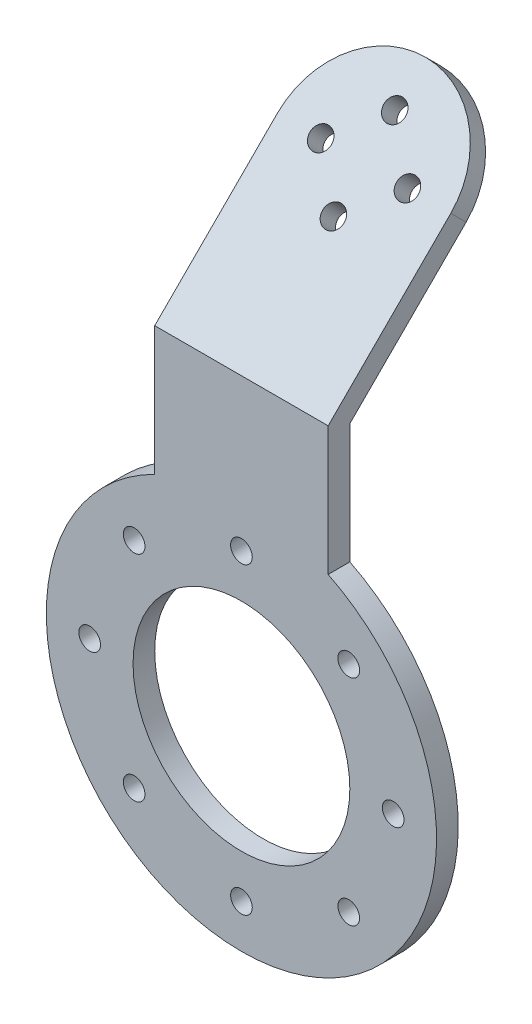
ISO-10303-21;
HEADER;
FILE_DESCRIPTION(('STEP AP214'),'2;1');
FILE_NAME('part.step','',(''),(''),'','','');
FILE_SCHEMA(('AUTOMOTIVE_DESIGN { 1 0 10303 214 1 1 1 1 }'));
ENDSEC;
DATA;
#1=APPLICATION_CONTEXT('core data for automotive mechanical design processes');
#2=APPLICATION_PROTOCOL_DEFINITION('international standard','automotive_design',2000,#1);
#3=PRODUCT_CONTEXT('',#1,'mechanical');
#4=PRODUCT('Part','Part','',(#3));
#5=PRODUCT_RELATED_PRODUCT_CATEGORY('part','',(#4));
#6=PRODUCT_DEFINITION_FORMATION('','',#4);
#7=PRODUCT_DEFINITION_CONTEXT('part definition',#1,'design');
#8=PRODUCT_DEFINITION('design','',#6,#7);
#9=PRODUCT_DEFINITION_SHAPE('','',#8);
#10=(LENGTH_UNIT() NAMED_UNIT(*) SI_UNIT(.MILLI.,.METRE.));
#11=(NAMED_UNIT(*) PLANE_ANGLE_UNIT() SI_UNIT($,.RADIAN.));
#12=(NAMED_UNIT(*) SI_UNIT($,.STERADIAN.) SOLID_ANGLE_UNIT());
#13=UNCERTAINTY_MEASURE_WITH_UNIT(LENGTH_MEASURE(1.E-05),#10,'distance_accuracy_value','');
#14=(GEOMETRIC_REPRESENTATION_CONTEXT(3) GLOBAL_UNCERTAINTY_ASSIGNED_CONTEXT((#13)) GLOBAL_UNIT_ASSIGNED_CONTEXT((#10,
#11,#12)) REPRESENTATION_CONTEXT('',''));
#15=CARTESIAN_POINT('',(0.,0.,0.));
#16=DIRECTION('',(0.,0.,1.));
#17=DIRECTION('',(1.,0.,0.));
#18=AXIS2_PLACEMENT_3D('',#15,#16,#17);
#19=CARTESIAN_POINT('',(0.,0.,3.175));
#20=DIRECTION('',(0.,0.,1.));
#21=DIRECTION('',(1.,0.,0.));
#22=AXIS2_PLACEMENT_3D('',#19,#20,#21);
#23=PLANE('',#22);
#24=CARTESIAN_POINT('',(15.7154482118708,15.7154482118712,3.175));
#25=DIRECTION('',(0.,0.,1.));
#26=DIRECTION('',(0.707106781186556,-0.707106781186539,0.));
#27=AXIS2_PLACEMENT_3D('',#24,#25,#26);
#28=CIRCLE('',#27,1.5875);
#29=CARTESIAN_POINT('',(16.8379802270045,14.5929161967376,3.175));
#30=VERTEX_POINT('',#29);
#31=EDGE_CURVE('E271',#30,#30,#28,.T.);
#32=ORIENTED_EDGE('',*,*,#31,.F.);
#33=EDGE_LOOP('',(#32));
#34=FACE_BOUND('',#33,.T.);
#35=CARTESIAN_POINT('',(22.225,2.32794518267366E-13,3.175));
#36=DIRECTION('',(0.,0.,1.));
#37=DIRECTION('',(0.,-1.,0.));
#38=AXIS2_PLACEMENT_3D('',#35,#36,#37);
#39=CIRCLE('',#38,1.5875);
#40=CARTESIAN_POINT('',(22.225,-1.58749999999977,3.175));
#41=VERTEX_POINT('',#40);
#42=EDGE_CURVE('E582',#41,#41,#39,.T.);
#43=ORIENTED_EDGE('',*,*,#42,.F.);
#44=EDGE_LOOP('',(#43));
#45=FACE_BOUND('',#44,.T.);
#46=CARTESIAN_POINT('',(15.7154482118712,-15.7154482118709,3.175));
#47=DIRECTION('',(0.,0.,1.));
#48=DIRECTION('',(-0.707106781186541,-0.707106781186554,0.));
#49=AXIS2_PLACEMENT_3D('',#46,#47,#48);
#50=CIRCLE('',#49,1.5875);
#51=CARTESIAN_POINT('',(14.5929161967375,-16.8379802270045,3.175));
#52=VERTEX_POINT('',#51);
#53=EDGE_CURVE('E321',#52,#52,#50,.T.);
#54=ORIENTED_EDGE('',*,*,#53,.F.);
#55=EDGE_LOOP('',(#54));
#56=FACE_BOUND('',#55,.T.);
#57=CARTESIAN_POINT('',(1.55196345511577E-13,-22.225,3.175));
#58=DIRECTION('',(0.,0.,1.));
#59=DIRECTION('',(-1.,0.,0.));
#60=AXIS2_PLACEMENT_3D('',#57,#58,#59);
#61=CIRCLE('',#60,1.5875);
#62=CARTESIAN_POINT('',(-1.58749999999984,-22.225,3.175));
#63=VERTEX_POINT('',#62);
#64=EDGE_CURVE('E316',#63,#63,#61,.T.);
#65=ORIENTED_EDGE('',*,*,#64,.F.);
#66=EDGE_LOOP('',(#65));
#67=FACE_BOUND('',#66,.T.);
#68=CARTESIAN_POINT('',(-15.7154482118709,-15.7154482118711,3.175));
#69=DIRECTION('',(0.,0.,1.));
#70=DIRECTION('',(-0.707106781186551,0.707106781186544,0.));
#71=AXIS2_PLACEMENT_3D('',#68,#69,#70);
#72=CIRCLE('',#71,1.5875);
#73=CARTESIAN_POINT('',(-16.8379802270046,-14.5929161967375,3.175));
#74=VERTEX_POINT('',#73);
#75=EDGE_CURVE('E200',#74,#74,#72,.T.);
#76=ORIENTED_EDGE('',*,*,#75,.F.);
#77=EDGE_LOOP('',(#76));
#78=FACE_BOUND('',#77,.T.);
#79=CARTESIAN_POINT('',(-22.225,0.,3.175));
#80=DIRECTION('',(0.,0.,1.));
#81=DIRECTION('',(0.,1.,0.));
#82=AXIS2_PLACEMENT_3D('',#79,#80,#81);
#83=CIRCLE('',#82,1.5875);
#84=CARTESIAN_POINT('',(-22.225,1.58749999999992,3.175));
#85=VERTEX_POINT('',#84);
#86=EDGE_CURVE('E193',#85,#85,#83,.T.);
#87=ORIENTED_EDGE('',*,*,#86,.F.);
#88=EDGE_LOOP('',(#87));
#89=FACE_BOUND('',#88,.T.);
#90=CARTESIAN_POINT('',(-15.715448211871,15.715448211871,3.175));
#91=DIRECTION('',(0.,0.,1.));
#92=DIRECTION('',(0.707106781186546,0.707106781186549,0.));
#93=AXIS2_PLACEMENT_3D('',#90,#91,#92);
#94=CIRCLE('',#93,1.5875);
#95=CARTESIAN_POINT('',(-14.5929161967374,16.8379802270046,3.175));
#96=VERTEX_POINT('',#95);
#97=EDGE_CURVE('E203',#96,#96,#94,.T.);
#98=ORIENTED_EDGE('',*,*,#97,.F.);
#99=EDGE_LOOP('',(#98));
#100=FACE_BOUND('',#99,.T.);
#101=CARTESIAN_POINT('',(0.,22.225,3.175));
#102=DIRECTION('',(0.,0.,1.));
#103=DIRECTION('',(1.,0.,0.));
#104=AXIS2_PLACEMENT_3D('',#101,#102,#103);
#105=CIRCLE('',#104,1.5875);
#106=CARTESIAN_POINT('',(1.5875,22.225,3.175));
#107=VERTEX_POINT('',#106);
#108=EDGE_CURVE('E179',#107,#107,#105,.T.);
#109=ORIENTED_EDGE('',*,*,#108,.F.);
#110=EDGE_LOOP('',(#109));
#111=FACE_BOUND('',#110,.T.);
#112=CARTESIAN_POINT('',(0.,0.,3.175));
#113=DIRECTION('',(0.,0.,1.));
#114=DIRECTION('',(1.,0.,0.));
#115=AXIS2_PLACEMENT_3D('',#112,#113,#114);
#116=CIRCLE('',#115,28.575);
#117=CARTESIAN_POINT('',(-12.7,25.5976683508479,3.175));
#118=VERTEX_POINT('',#117);
#119=CARTESIAN_POINT('',(12.7,25.5976683508479,3.175));
#120=VERTEX_POINT('',#119);
#121=EDGE_CURVE('E121',#118,#120,#116,.T.);
#122=ORIENTED_EDGE('',*,*,#121,.T.);
#123=DIRECTION('',(0.,1.,0.));
#124=VECTOR('',#123,1.);
#125=CARTESIAN_POINT('',(12.7,25.5976683508479,3.175));
#126=LINE('',#125,#124);
#127=CARTESIAN_POINT('',(12.7,44.45,3.175));
#128=VERTEX_POINT('',#127);
#129=EDGE_CURVE('E110',#120,#128,#126,.T.);
#130=ORIENTED_EDGE('',*,*,#129,.T.);
#131=DIRECTION('',(-1.,0.,0.));
#132=VECTOR('',#131,1.);
#133=CARTESIAN_POINT('',(-12.7,44.45,3.175));
#134=LINE('',#133,#132);
#135=CARTESIAN_POINT('',(-12.7,44.45,3.175));
#136=VERTEX_POINT('',#135);
#137=EDGE_CURVE('E120',#128,#136,#134,.T.);
#138=ORIENTED_EDGE('',*,*,#137,.T.);
#139=DIRECTION('',(0.,-1.,0.));
#140=VECTOR('',#139,1.);
#141=CARTESIAN_POINT('',(-12.7,25.5976683508479,3.175));
#142=LINE('',#141,#140);
#143=EDGE_CURVE('E72',#136,#118,#142,.T.);
#144=ORIENTED_EDGE('',*,*,#143,.T.);
#145=EDGE_LOOP('',(#122,#130,#138,#144));
#146=FACE_BOUND('',#145,.T.);
#147=CARTESIAN_POINT('',(0.,0.,3.175));
#148=DIRECTION('',(0.,0.,1.));
#149=DIRECTION('',(1.,0.,0.));
#150=AXIS2_PLACEMENT_3D('',#147,#148,#149);
#151=CIRCLE('',#150,15.875);
#152=CARTESIAN_POINT('',(15.875,0.,3.175));
#153=VERTEX_POINT('',#152);
#154=EDGE_CURVE('E133',#153,#153,#151,.T.);
#155=ORIENTED_EDGE('',*,*,#154,.F.);
#156=EDGE_LOOP('',(#155));
#157=FACE_BOUND('',#156,.T.);
#158=ADVANCED_FACE('F47',(#34,#45,#56,#67,#78,#89,#100,#111,#146,#157),#23,.T.);
#159=CARTESIAN_POINT('',(0.,0.,0.));
#160=DIRECTION('',(0.,0.,1.));
#161=DIRECTION('',(1.,0.,0.));
#162=AXIS2_PLACEMENT_3D('',#159,#160,#161);
#163=PLANE('',#162);
#164=CARTESIAN_POINT('',(15.7154482118708,15.7154482118712,0.));
#165=DIRECTION('',(0.,0.,1.));
#166=DIRECTION('',(1.,0.,0.));
#167=AXIS2_PLACEMENT_3D('',#164,#165,#166);
#168=CIRCLE('',#167,1.5875);
#169=CARTESIAN_POINT('',(17.3029482118708,15.7154482118712,0.));
#170=VERTEX_POINT('',#169);
#171=EDGE_CURVE('E52',#170,#170,#168,.T.);
#172=ORIENTED_EDGE('',*,*,#171,.T.);
#173=EDGE_LOOP('',(#172));
#174=FACE_BOUND('',#173,.T.);
#175=CARTESIAN_POINT('',(22.225,2.32794518267366E-13,0.));
#176=DIRECTION('',(0.,0.,1.));
#177=DIRECTION('',(1.,0.,0.));
#178=AXIS2_PLACEMENT_3D('',#175,#176,#177);
#179=CIRCLE('',#178,1.5875);
#180=CARTESIAN_POINT('',(23.8125,2.32794518267366E-13,0.));
#181=VERTEX_POINT('',#180);
#182=EDGE_CURVE('E578',#181,#181,#179,.T.);
#183=ORIENTED_EDGE('',*,*,#182,.T.);
#184=EDGE_LOOP('',(#183));
#185=FACE_BOUND('',#184,.T.);
#186=CARTESIAN_POINT('',(15.7154482118712,-15.7154482118709,0.));
#187=DIRECTION('',(0.,0.,1.));
#188=DIRECTION('',(1.,0.,0.));
#189=AXIS2_PLACEMENT_3D('',#186,#187,#188);
#190=CIRCLE('',#189,1.5875);
#191=CARTESIAN_POINT('',(17.3029482118712,-15.7154482118709,0.));
#192=VERTEX_POINT('',#191);
#193=EDGE_CURVE('E320',#192,#192,#190,.T.);
#194=ORIENTED_EDGE('',*,*,#193,.T.);
#195=EDGE_LOOP('',(#194));
#196=FACE_BOUND('',#195,.T.);
#197=CARTESIAN_POINT('',(1.55196345511577E-13,-22.225,0.));
#198=DIRECTION('',(0.,0.,1.));
#199=DIRECTION('',(1.,0.,0.));
#200=AXIS2_PLACEMENT_3D('',#197,#198,#199);
#201=CIRCLE('',#200,1.5875);
#202=CARTESIAN_POINT('',(1.58750000000015,-22.225,0.));
#203=VERTEX_POINT('',#202);
#204=EDGE_CURVE('E243',#203,#203,#201,.T.);
#205=ORIENTED_EDGE('',*,*,#204,.T.);
#206=EDGE_LOOP('',(#205));
#207=FACE_BOUND('',#206,.T.);
#208=CARTESIAN_POINT('',(-15.7154482118709,-15.7154482118711,0.));
#209=DIRECTION('',(0.,0.,1.));
#210=DIRECTION('',(1.,0.,0.));
#211=AXIS2_PLACEMENT_3D('',#208,#209,#210);
#212=CIRCLE('',#211,1.5875);
#213=CARTESIAN_POINT('',(-14.1279482118709,-15.7154482118711,0.));
#214=VERTEX_POINT('',#213);
#215=EDGE_CURVE('E199',#214,#214,#212,.T.);
#216=ORIENTED_EDGE('',*,*,#215,.T.);
#217=EDGE_LOOP('',(#216));
#218=FACE_BOUND('',#217,.T.);
#219=CARTESIAN_POINT('',(-22.225,0.,0.));
#220=DIRECTION('',(0.,0.,1.));
#221=DIRECTION('',(1.,0.,0.));
#222=AXIS2_PLACEMENT_3D('',#219,#220,#221);
#223=CIRCLE('',#222,1.5875);
#224=CARTESIAN_POINT('',(-20.6375,0.,0.));
#225=VERTEX_POINT('',#224);
#226=EDGE_CURVE('E198',#225,#225,#223,.T.);
#227=ORIENTED_EDGE('',*,*,#226,.T.);
#228=EDGE_LOOP('',(#227));
#229=FACE_BOUND('',#228,.T.);
#230=CARTESIAN_POINT('',(-15.715448211871,15.715448211871,0.));
#231=DIRECTION('',(0.,0.,1.));
#232=DIRECTION('',(1.,0.,0.));
#233=AXIS2_PLACEMENT_3D('',#230,#231,#232);
#234=CIRCLE('',#233,1.5875);
#235=CARTESIAN_POINT('',(-14.127948211871,15.715448211871,0.));
#236=VERTEX_POINT('',#235);
#237=EDGE_CURVE('E208',#236,#236,#234,.T.);
#238=ORIENTED_EDGE('',*,*,#237,.T.);
#239=EDGE_LOOP('',(#238));
#240=FACE_BOUND('',#239,.T.);
#241=CARTESIAN_POINT('',(0.,22.225,0.));
#242=DIRECTION('',(0.,0.,1.));
#243=DIRECTION('',(1.,0.,0.));
#244=AXIS2_PLACEMENT_3D('',#241,#242,#243);
#245=CIRCLE('',#244,1.5875);
#246=CARTESIAN_POINT('',(1.5875,22.225,0.));
#247=VERTEX_POINT('',#246);
#248=EDGE_CURVE('E162',#247,#247,#245,.T.);
#249=ORIENTED_EDGE('',*,*,#248,.T.);
#250=EDGE_LOOP('',(#249));
#251=FACE_BOUND('',#250,.T.);
#252=DIRECTION('',(0.,-1.,0.));
#253=VECTOR('',#252,1.);
#254=CARTESIAN_POINT('',(-12.7,25.5976683508479,0.));
#255=LINE('',#254,#253);
#256=CARTESIAN_POINT('',(-12.7,43.1348719394654,0.));
#257=VERTEX_POINT('',#256);
#258=CARTESIAN_POINT('',(-12.7,25.5976683508479,0.));
#259=VERTEX_POINT('',#258);
#260=EDGE_CURVE('E128',#257,#259,#255,.T.);
#261=ORIENTED_EDGE('',*,*,#260,.F.);
#262=DIRECTION('',(1.,0.,0.));
#263=VECTOR('',#262,1.);
#264=CARTESIAN_POINT('',(0.,43.1348719394654,0.));
#265=LINE('',#264,#263);
#266=CARTESIAN_POINT('',(12.7,43.1348719394654,0.));
#267=VERTEX_POINT('',#266);
#268=EDGE_CURVE('E223',#257,#267,#265,.T.);
#269=ORIENTED_EDGE('',*,*,#268,.T.);
#270=DIRECTION('',(0.,1.,0.));
#271=VECTOR('',#270,1.);
#272=CARTESIAN_POINT('',(12.7,25.5976683508479,0.));
#273=LINE('',#272,#271);
#274=CARTESIAN_POINT('',(12.7,25.5976683508479,0.));
#275=VERTEX_POINT('',#274);
#276=EDGE_CURVE('E88',#275,#267,#273,.T.);
#277=ORIENTED_EDGE('',*,*,#276,.F.);
#278=CARTESIAN_POINT('',(0.,0.,0.));
#279=DIRECTION('',(0.,0.,1.));
#280=DIRECTION('',(1.,0.,0.));
#281=AXIS2_PLACEMENT_3D('',#278,#279,#280);
#282=CIRCLE('',#281,28.575);
#283=EDGE_CURVE('E130',#259,#275,#282,.T.);
#284=ORIENTED_EDGE('',*,*,#283,.F.);
#285=EDGE_LOOP('',(#261,#269,#277,#284));
#286=FACE_BOUND('',#285,.T.);
#287=CARTESIAN_POINT('',(0.,0.,0.));
#288=DIRECTION('',(0.,0.,1.));
#289=DIRECTION('',(1.,0.,0.));
#290=AXIS2_PLACEMENT_3D('',#287,#288,#289);
#291=CIRCLE('',#290,15.875);
#292=CARTESIAN_POINT('',(15.875,0.,0.));
#293=VERTEX_POINT('',#292);
#294=EDGE_CURVE('E140',#293,#293,#291,.T.);
#295=ORIENTED_EDGE('',*,*,#294,.T.);
#296=EDGE_LOOP('',(#295));
#297=FACE_BOUND('',#296,.T.);
#298=ADVANCED_FACE('F347',(#174,#185,#196,#207,#218,#229,#240,#251,#286,#297),#163,.F.);
#299=CARTESIAN_POINT('',(0.,0.,3.175));
#300=DIRECTION('',(0.,0.,-1.));
#301=DIRECTION('',(-1.,0.,0.));
#302=AXIS2_PLACEMENT_3D('',#299,#300,#301);
#303=CYLINDRICAL_SURFACE('',#302,28.575);
#304=ORIENTED_EDGE('',*,*,#283,.T.);
#305=DIRECTION('',(0.,0.,-1.));
#306=VECTOR('',#305,1.);
#307=CARTESIAN_POINT('',(12.7,25.5976683508479,3.175));
#308=LINE('',#307,#306);
#309=EDGE_CURVE('E12',#120,#275,#308,.T.);
#310=ORIENTED_EDGE('',*,*,#309,.F.);
#311=ORIENTED_EDGE('',*,*,#121,.F.);
#312=DIRECTION('',(0.,0.,-1.));
#313=VECTOR('',#312,1.);
#314=CARTESIAN_POINT('',(-12.7,25.5976683508479,3.175));
#315=LINE('',#314,#313);
#316=EDGE_CURVE('E60',#118,#259,#315,.T.);
#317=ORIENTED_EDGE('',*,*,#316,.T.);
#318=EDGE_LOOP('',(#304,#310,#311,#317));
#319=FACE_BOUND('',#318,.T.);
#320=ADVANCED_FACE('F50',(#319),#303,.T.);
#321=CARTESIAN_POINT('',(12.7,25.5976683508479,3.175));
#322=DIRECTION('',(-1.,0.,0.));
#323=DIRECTION('',(0.,-1.,0.));
#324=AXIS2_PLACEMENT_3D('',#321,#322,#323);
#325=PLANE('',#324);
#326=DIRECTION('',(0.,0.707106781186546,-0.707106781186549));
#327=VECTOR('',#326,1.);
#328=CARTESIAN_POINT('',(12.7,62.4105122421383,-14.7855122421383));
#329=LINE('',#328,#327);
#330=CARTESIAN_POINT('',(12.7,62.4105122421383,-14.7855122421383));
#331=VERTEX_POINT('',#330);
#332=EDGE_CURVE('E117',#128,#331,#329,.T.);
#333=ORIENTED_EDGE('',*,*,#332,.F.);
#334=ORIENTED_EDGE('',*,*,#129,.F.);
#335=ORIENTED_EDGE('',*,*,#309,.T.);
#336=ORIENTED_EDGE('',*,*,#276,.T.);
#337=DIRECTION('',(0.,0.707106781186546,-0.707106781186549));
#338=VECTOR('',#337,1.);
#339=CARTESIAN_POINT('',(12.7,60.165448211871,-17.0305762724056));
#340=LINE('',#339,#338);
#341=CARTESIAN_POINT('',(12.7,60.165448211871,-17.0305762724056));
#342=VERTEX_POINT('',#341);
#343=EDGE_CURVE('E100',#267,#342,#340,.T.);
#344=ORIENTED_EDGE('',*,*,#343,.T.);
#345=DIRECTION('',(0.,0.707106781186549,0.707106781186546));
#346=VECTOR('',#345,1.);
#347=CARTESIAN_POINT('',(12.7,60.165448211871,-17.0305762724056));
#348=LINE('',#347,#346);
#349=EDGE_CURVE('E224',#342,#331,#348,.T.);
#350=ORIENTED_EDGE('',*,*,#349,.T.);
#351=EDGE_LOOP('',(#333,#334,#335,#336,#344,#350));
#352=FACE_BOUND('',#351,.T.);
#353=ADVANCED_FACE('F111',(#352),#325,.F.);
#354=CARTESIAN_POINT('',(-12.7,25.5976683508479,3.175));
#355=DIRECTION('',(1.,0.,0.));
#356=DIRECTION('',(0.,0.,-1.));
#357=AXIS2_PLACEMENT_3D('',#354,#355,#356);
#358=PLANE('',#357);
#359=DIRECTION('',(0.,-0.707106781186546,0.707106781186549));
#360=VECTOR('',#359,1.);
#361=CARTESIAN_POINT('',(-12.7,42.2049359697327,0.92993596973272));
#362=LINE('',#361,#360);
#363=CARTESIAN_POINT('',(-12.7,60.165448211871,-17.0305762724056));
#364=VERTEX_POINT('',#363);
#365=EDGE_CURVE('E567',#364,#257,#362,.T.);
#366=ORIENTED_EDGE('',*,*,#365,.T.);
#367=ORIENTED_EDGE('',*,*,#260,.T.);
#368=ORIENTED_EDGE('',*,*,#316,.F.);
#369=ORIENTED_EDGE('',*,*,#143,.F.);
#370=DIRECTION('',(0.,-0.707106781186546,0.707106781186549));
#371=VECTOR('',#370,1.);
#372=CARTESIAN_POINT('',(-12.7,44.45,3.175));
#373=LINE('',#372,#371);
#374=CARTESIAN_POINT('',(-12.7,62.4105122421383,-14.7855122421383));
#375=VERTEX_POINT('',#374);
#376=EDGE_CURVE('E178',#375,#136,#373,.T.);
#377=ORIENTED_EDGE('',*,*,#376,.F.);
#378=DIRECTION('',(0.,0.707106781186549,0.707106781186546));
#379=VECTOR('',#378,1.);
#380=CARTESIAN_POINT('',(-12.7,60.165448211871,-17.0305762724056));
#381=LINE('',#380,#379);
#382=EDGE_CURVE('E218',#364,#375,#381,.T.);
#383=ORIENTED_EDGE('',*,*,#382,.F.);
#384=EDGE_LOOP('',(#366,#367,#368,#369,#377,#383));
#385=FACE_BOUND('',#384,.T.);
#386=ADVANCED_FACE('F352',(#385),#358,.F.);
#387=CARTESIAN_POINT('',(0.,0.,3.175));
#388=DIRECTION('',(0.,0.,-1.));
#389=DIRECTION('',(-1.,0.,0.));
#390=AXIS2_PLACEMENT_3D('',#387,#388,#389);
#391=CYLINDRICAL_SURFACE('',#390,15.875);
#392=ORIENTED_EDGE('',*,*,#154,.T.);
#393=EDGE_LOOP('',(#392));
#394=FACE_BOUND('',#393,.T.);
#395=ORIENTED_EDGE('',*,*,#294,.F.);
#396=EDGE_LOOP('',(#395));
#397=FACE_BOUND('',#396,.T.);
#398=ADVANCED_FACE('F349',(#394,#397),#391,.F.);
#399=CARTESIAN_POINT('',(0.,60.165448211871,-17.0305762724056));
#400=DIRECTION('',(0.,-0.707106781186549,-0.707106781186546));
#401=DIRECTION('',(0.,0.707106781186546,-0.707106781186549));
#402=AXIS2_PLACEMENT_3D('',#399,#400,#401);
#403=PLANE('',#402);
#404=CARTESIAN_POINT('',(6.35,60.165448211871,-17.0305762724057));
#405=DIRECTION('',(0.,-0.707106781186549,-0.707106781186546));
#406=DIRECTION('',(0.,0.707106781186546,-0.707106781186549));
#407=AXIS2_PLACEMENT_3D('',#404,#405,#406);
#408=CIRCLE('',#407,1.5875);
#409=CARTESIAN_POINT('',(6.35,61.2879802270047,-18.1531082875393));
#410=VERTEX_POINT('',#409);
#411=EDGE_CURVE('E302',#410,#410,#408,.T.);
#412=ORIENTED_EDGE('',*,*,#411,.F.);
#413=EDGE_LOOP('',(#412));
#414=FACE_BOUND('',#413,.T.);
#415=CARTESIAN_POINT('',(0.,55.6753201513364,-12.540448211871));
#416=DIRECTION('',(0.,-0.707106781186549,-0.707106781186546));
#417=DIRECTION('',(0.,0.707106781186546,-0.707106781186549));
#418=AXIS2_PLACEMENT_3D('',#415,#416,#417);
#419=CIRCLE('',#418,1.5875);
#420=CARTESIAN_POINT('',(0.,56.7978521664701,-13.6629802270047));
#421=VERTEX_POINT('',#420);
#422=EDGE_CURVE('E659',#421,#421,#419,.T.);
#423=ORIENTED_EDGE('',*,*,#422,.F.);
#424=EDGE_LOOP('',(#423));
#425=FACE_BOUND('',#424,.T.);
#426=CARTESIAN_POINT('',(-6.35,60.165448211871,-17.0305762724056));
#427=DIRECTION('',(0.,-0.707106781186549,-0.707106781186546));
#428=DIRECTION('',(0.,0.707106781186546,-0.707106781186549));
#429=AXIS2_PLACEMENT_3D('',#426,#427,#428);
#430=CIRCLE('',#429,1.5875);
#431=CARTESIAN_POINT('',(-6.35,61.2879802270046,-18.1531082875392));
#432=VERTEX_POINT('',#431);
#433=EDGE_CURVE('E287',#432,#432,#430,.T.);
#434=ORIENTED_EDGE('',*,*,#433,.F.);
#435=EDGE_LOOP('',(#434));
#436=FACE_BOUND('',#435,.T.);
#437=CARTESIAN_POINT('',(0.,64.6555762724055,-21.5207043329402));
#438=DIRECTION('',(0.,-0.707106781186549,-0.707106781186546));
#439=DIRECTION('',(0.,0.707106781186546,-0.707106781186549));
#440=AXIS2_PLACEMENT_3D('',#437,#438,#439);
#441=CIRCLE('',#440,1.5875);
#442=CARTESIAN_POINT('',(0.,65.7781082875392,-22.6432363480738));
#443=VERTEX_POINT('',#442);
#444=EDGE_CURVE('E266',#443,#443,#441,.T.);
#445=ORIENTED_EDGE('',*,*,#444,.F.);
#446=EDGE_LOOP('',(#445));
#447=FACE_BOUND('',#446,.T.);
#448=ORIENTED_EDGE('',*,*,#268,.F.);
#449=ORIENTED_EDGE('',*,*,#365,.F.);
#450=CARTESIAN_POINT('',(0.,60.165448211871,-17.0305762724056));
#451=DIRECTION('',(0.,0.707106781186549,0.707106781186546));
#452=DIRECTION('',(0.,0.707106781186546,-0.707106781186549));
#453=AXIS2_PLACEMENT_3D('',#450,#451,#452);
#454=CIRCLE('',#453,12.7);
#455=EDGE_CURVE('E177',#342,#364,#454,.T.);
#456=ORIENTED_EDGE('',*,*,#455,.F.);
#457=ORIENTED_EDGE('',*,*,#343,.F.);
#458=EDGE_LOOP('',(#448,#449,#456,#457));
#459=FACE_BOUND('',#458,.T.);
#460=ADVANCED_FACE('F351',(#414,#425,#436,#447,#459),#403,.T.);
#461=CARTESIAN_POINT('',(0.,60.165448211871,-17.0305762724056));
#462=DIRECTION('',(0.,0.707106781186549,0.707106781186546));
#463=DIRECTION('',(0.,-0.707106781186546,0.707106781186549));
#464=AXIS2_PLACEMENT_3D('',#461,#462,#463);
#465=CYLINDRICAL_SURFACE('',#464,12.7);
#466=CARTESIAN_POINT('',(0.,62.4105122421383,-14.7855122421383));
#467=DIRECTION('',(0.,0.707106781186549,0.707106781186546));
#468=DIRECTION('',(0.,0.707106781186546,-0.707106781186549));
#469=AXIS2_PLACEMENT_3D('',#466,#467,#468);
#470=CIRCLE('',#469,12.7);
#471=EDGE_CURVE('E554',#331,#375,#470,.T.);
#472=ORIENTED_EDGE('',*,*,#471,.F.);
#473=ORIENTED_EDGE('',*,*,#349,.F.);
#474=ORIENTED_EDGE('',*,*,#455,.T.);
#475=ORIENTED_EDGE('',*,*,#382,.T.);
#476=EDGE_LOOP('',(#472,#473,#474,#475));
#477=FACE_BOUND('',#476,.T.);
#478=ADVANCED_FACE('F359',(#477),#465,.T.);
#479=CARTESIAN_POINT('',(0.,62.4105122421383,-14.7855122421383));
#480=DIRECTION('',(0.,-0.707106781186549,-0.707106781186546));
#481=DIRECTION('',(0.,0.707106781186546,-0.707106781186549));
#482=AXIS2_PLACEMENT_3D('',#479,#480,#481);
#483=PLANE('',#482);
#484=CARTESIAN_POINT('',(6.35,62.4105122421383,-14.7855122421384));
#485=DIRECTION('',(0.,0.707106781186549,0.707106781186546));
#486=DIRECTION('',(-1.,0.,0.));
#487=AXIS2_PLACEMENT_3D('',#484,#485,#486);
#488=CIRCLE('',#487,1.5875);
#489=CARTESIAN_POINT('',(4.7625,62.4105122421383,-14.7855122421384));
#490=VERTEX_POINT('',#489);
#491=EDGE_CURVE('E308',#490,#490,#488,.T.);
#492=ORIENTED_EDGE('',*,*,#491,.F.);
#493=EDGE_LOOP('',(#492));
#494=FACE_BOUND('',#493,.T.);
#495=CARTESIAN_POINT('',(0.,57.9203841816037,-10.2953841816038));
#496=DIRECTION('',(0.,0.707106781186549,0.707106781186546));
#497=DIRECTION('',(0.,0.707106781186546,-0.707106781186549));
#498=AXIS2_PLACEMENT_3D('',#495,#496,#497);
#499=CIRCLE('',#498,1.5875);
#500=CARTESIAN_POINT('',(0.,59.0429161967374,-11.4179161967374));
#501=VERTEX_POINT('',#500);
#502=EDGE_CURVE('E307',#501,#501,#499,.T.);
#503=ORIENTED_EDGE('',*,*,#502,.F.);
#504=EDGE_LOOP('',(#503));
#505=FACE_BOUND('',#504,.T.);
#506=CARTESIAN_POINT('',(-6.35,62.4105122421383,-14.7855122421383));
#507=DIRECTION('',(0.,0.707106781186549,0.707106781186546));
#508=DIRECTION('',(1.,0.,0.));
#509=AXIS2_PLACEMENT_3D('',#506,#507,#508);
#510=CIRCLE('',#509,1.5875);
#511=CARTESIAN_POINT('',(-4.7625,62.4105122421383,-14.7855122421383));
#512=VERTEX_POINT('',#511);
#513=EDGE_CURVE('E291',#512,#512,#510,.T.);
#514=ORIENTED_EDGE('',*,*,#513,.F.);
#515=EDGE_LOOP('',(#514));
#516=FACE_BOUND('',#515,.T.);
#517=CARTESIAN_POINT('',(0.,66.9006403026728,-19.2756403026729));
#518=DIRECTION('',(0.,0.707106781186549,0.707106781186546));
#519=DIRECTION('',(0.,-0.707106781186546,0.707106781186549));
#520=AXIS2_PLACEMENT_3D('',#517,#518,#519);
#521=CIRCLE('',#520,1.5875);
#522=CARTESIAN_POINT('',(0.,65.7781082875392,-18.1531082875393));
#523=VERTEX_POINT('',#522);
#524=EDGE_CURVE('E272',#523,#523,#521,.T.);
#525=ORIENTED_EDGE('',*,*,#524,.F.);
#526=EDGE_LOOP('',(#525));
#527=FACE_BOUND('',#526,.T.);
#528=ORIENTED_EDGE('',*,*,#137,.F.);
#529=ORIENTED_EDGE('',*,*,#332,.T.);
#530=ORIENTED_EDGE('',*,*,#471,.T.);
#531=ORIENTED_EDGE('',*,*,#376,.T.);
#532=EDGE_LOOP('',(#528,#529,#530,#531));
#533=FACE_BOUND('',#532,.T.);
#534=ADVANCED_FACE('F456',(#494,#505,#516,#527,#533),#483,.F.);
#535=CARTESIAN_POINT('',(0.,22.225,-26.0108323934748));
#536=DIRECTION('',(0.,0.,1.));
#537=DIRECTION('',(1.,0.,0.));
#538=AXIS2_PLACEMENT_3D('',#535,#536,#537);
#539=CYLINDRICAL_SURFACE('',#538,1.5875);
#540=ORIENTED_EDGE('',*,*,#108,.T.);
#541=EDGE_LOOP('',(#540));
#542=FACE_BOUND('',#541,.T.);
#543=ORIENTED_EDGE('',*,*,#248,.F.);
#544=EDGE_LOOP('',(#543));
#545=FACE_BOUND('',#544,.T.);
#546=ADVANCED_FACE('F460',(#542,#545),#539,.F.);
#547=CARTESIAN_POINT('',(-15.715448211871,15.715448211871,-26.0108323934748));
#548=DIRECTION('',(0.,0.,1.));
#549=DIRECTION('',(1.,0.,0.));
#550=AXIS2_PLACEMENT_3D('',#547,#548,#549);
#551=CYLINDRICAL_SURFACE('',#550,1.5875);
#552=ORIENTED_EDGE('',*,*,#97,.T.);
#553=EDGE_LOOP('',(#552));
#554=FACE_BOUND('',#553,.T.);
#555=ORIENTED_EDGE('',*,*,#237,.F.);
#556=EDGE_LOOP('',(#555));
#557=FACE_BOUND('',#556,.T.);
#558=ADVANCED_FACE('F474',(#554,#557),#551,.F.);
#559=CARTESIAN_POINT('',(-22.225,0.,-26.0108323934748));
#560=DIRECTION('',(0.,0.,1.));
#561=DIRECTION('',(1.,0.,0.));
#562=AXIS2_PLACEMENT_3D('',#559,#560,#561);
#563=CYLINDRICAL_SURFACE('',#562,1.5875);
#564=ORIENTED_EDGE('',*,*,#86,.T.);
#565=EDGE_LOOP('',(#564));
#566=FACE_BOUND('',#565,.T.);
#567=ORIENTED_EDGE('',*,*,#226,.F.);
#568=EDGE_LOOP('',(#567));
#569=FACE_BOUND('',#568,.T.);
#570=ADVANCED_FACE('F483',(#566,#569),#563,.F.);
#571=CARTESIAN_POINT('',(-15.7154482118709,-15.7154482118711,-26.0108323934748));
#572=DIRECTION('',(0.,0.,1.));
#573=DIRECTION('',(1.,0.,0.));
#574=AXIS2_PLACEMENT_3D('',#571,#572,#573);
#575=CYLINDRICAL_SURFACE('',#574,1.5875);
#576=ORIENTED_EDGE('',*,*,#75,.T.);
#577=EDGE_LOOP('',(#576));
#578=FACE_BOUND('',#577,.T.);
#579=ORIENTED_EDGE('',*,*,#215,.F.);
#580=EDGE_LOOP('',(#579));
#581=FACE_BOUND('',#580,.T.);
#582=ADVANCED_FACE('F492',(#578,#581),#575,.F.);
#583=CARTESIAN_POINT('',(1.55196345511577E-13,-22.225,-26.0108323934748));
#584=DIRECTION('',(0.,0.,1.));
#585=DIRECTION('',(1.,0.,0.));
#586=AXIS2_PLACEMENT_3D('',#583,#584,#585);
#587=CYLINDRICAL_SURFACE('',#586,1.5875);
#588=ORIENTED_EDGE('',*,*,#64,.T.);
#589=EDGE_LOOP('',(#588));
#590=FACE_BOUND('',#589,.T.);
#591=ORIENTED_EDGE('',*,*,#204,.F.);
#592=EDGE_LOOP('',(#591));
#593=FACE_BOUND('',#592,.T.);
#594=ADVANCED_FACE('F501',(#590,#593),#587,.F.);
#595=CARTESIAN_POINT('',(15.7154482118712,-15.7154482118709,-26.0108323934748));
#596=DIRECTION('',(0.,0.,1.));
#597=DIRECTION('',(1.,0.,0.));
#598=AXIS2_PLACEMENT_3D('',#595,#596,#597);
#599=CYLINDRICAL_SURFACE('',#598,1.5875);
#600=ORIENTED_EDGE('',*,*,#53,.T.);
#601=EDGE_LOOP('',(#600));
#602=FACE_BOUND('',#601,.T.);
#603=ORIENTED_EDGE('',*,*,#193,.F.);
#604=EDGE_LOOP('',(#603));
#605=FACE_BOUND('',#604,.T.);
#606=ADVANCED_FACE('F510',(#602,#605),#599,.F.);
#607=CARTESIAN_POINT('',(22.225,2.32794518267366E-13,-26.0108323934748));
#608=DIRECTION('',(0.,0.,1.));
#609=DIRECTION('',(1.,0.,0.));
#610=AXIS2_PLACEMENT_3D('',#607,#608,#609);
#611=CYLINDRICAL_SURFACE('',#610,1.5875);
#612=ORIENTED_EDGE('',*,*,#42,.T.);
#613=EDGE_LOOP('',(#612));
#614=FACE_BOUND('',#613,.T.);
#615=ORIENTED_EDGE('',*,*,#182,.F.);
#616=EDGE_LOOP('',(#615));
#617=FACE_BOUND('',#616,.T.);
#618=ADVANCED_FACE('F519',(#614,#617),#611,.F.);
#619=CARTESIAN_POINT('',(15.7154482118708,15.7154482118712,-26.0108323934748));
#620=DIRECTION('',(0.,0.,1.));
#621=DIRECTION('',(1.,0.,0.));
#622=AXIS2_PLACEMENT_3D('',#619,#620,#621);
#623=CYLINDRICAL_SURFACE('',#622,1.5875);
#624=ORIENTED_EDGE('',*,*,#31,.T.);
#625=EDGE_LOOP('',(#624));
#626=FACE_BOUND('',#625,.T.);
#627=ORIENTED_EDGE('',*,*,#171,.F.);
#628=EDGE_LOOP('',(#627));
#629=FACE_BOUND('',#628,.T.);
#630=ADVANCED_FACE('F410',(#626,#629),#623,.F.);
#631=CARTESIAN_POINT('',(0.,15.7952241059353,-70.3810564994103));
#632=DIRECTION('',(0.,0.707106781186549,0.707106781186546));
#633=DIRECTION('',(0.,-0.707106781186546,0.707106781186549));
#634=AXIS2_PLACEMENT_3D('',#631,#632,#633);
#635=CYLINDRICAL_SURFACE('',#634,1.5875);
#636=ORIENTED_EDGE('',*,*,#444,.T.);
#637=EDGE_LOOP('',(#636));
#638=FACE_BOUND('',#637,.T.);
#639=ORIENTED_EDGE('',*,*,#524,.T.);
#640=EDGE_LOOP('',(#639));
#641=FACE_BOUND('',#640,.T.);
#642=ADVANCED_FACE('F415',(#638,#641),#635,.F.);
#643=CARTESIAN_POINT('',(-6.35,11.3050960454007,-65.8909284388757));
#644=DIRECTION('',(0.,0.707106781186549,0.707106781186546));
#645=DIRECTION('',(0.,-0.707106781186546,0.707106781186549));
#646=AXIS2_PLACEMENT_3D('',#643,#644,#645);
#647=CYLINDRICAL_SURFACE('',#646,1.5875);
#648=ORIENTED_EDGE('',*,*,#433,.T.);
#649=EDGE_LOOP('',(#648));
#650=FACE_BOUND('',#649,.T.);
#651=ORIENTED_EDGE('',*,*,#513,.T.);
#652=EDGE_LOOP('',(#651));
#653=FACE_BOUND('',#652,.T.);
#654=ADVANCED_FACE('F421',(#650,#653),#647,.F.);
#655=CARTESIAN_POINT('',(0.,6.81496798486617,-61.4008003783411));
#656=DIRECTION('',(0.,0.707106781186549,0.707106781186546));
#657=DIRECTION('',(0.,-0.707106781186546,0.707106781186549));
#658=AXIS2_PLACEMENT_3D('',#655,#656,#657);
#659=CYLINDRICAL_SURFACE('',#658,1.5875);
#660=ORIENTED_EDGE('',*,*,#422,.T.);
#661=EDGE_LOOP('',(#660));
#662=FACE_BOUND('',#661,.T.);
#663=ORIENTED_EDGE('',*,*,#502,.T.);
#664=EDGE_LOOP('',(#663));
#665=FACE_BOUND('',#664,.T.);
#666=ADVANCED_FACE('F432',(#662,#665),#659,.F.);
#667=CARTESIAN_POINT('',(6.35,11.3050960454008,-65.8909284388757));
#668=DIRECTION('',(0.,0.707106781186549,0.707106781186546));
#669=DIRECTION('',(0.,-0.707106781186546,0.707106781186549));
#670=AXIS2_PLACEMENT_3D('',#667,#668,#669);
#671=CYLINDRICAL_SURFACE('',#670,1.5875);
#672=ORIENTED_EDGE('',*,*,#411,.T.);
#673=EDGE_LOOP('',(#672));
#674=FACE_BOUND('',#673,.T.);
#675=ORIENTED_EDGE('',*,*,#491,.T.);
#676=EDGE_LOOP('',(#675));
#677=FACE_BOUND('',#676,.T.);
#678=ADVANCED_FACE('F443',(#674,#677),#671,.F.);
#679=CLOSED_SHELL('',(#158,#298,#320,#353,#386,#398,#460,#478,#534,#546,#558,#570,#582,#594,
#606,#618,#630,#642,#654,#666,#678));
#680=MANIFOLD_SOLID_BREP('B2',#679);
#681=ADVANCED_BREP_SHAPE_REPRESENTATION('',(#18,#680),#14);
#682=SHAPE_DEFINITION_REPRESENTATION(#9,#681);
ENDSEC;
END-ISO-10303-21;
